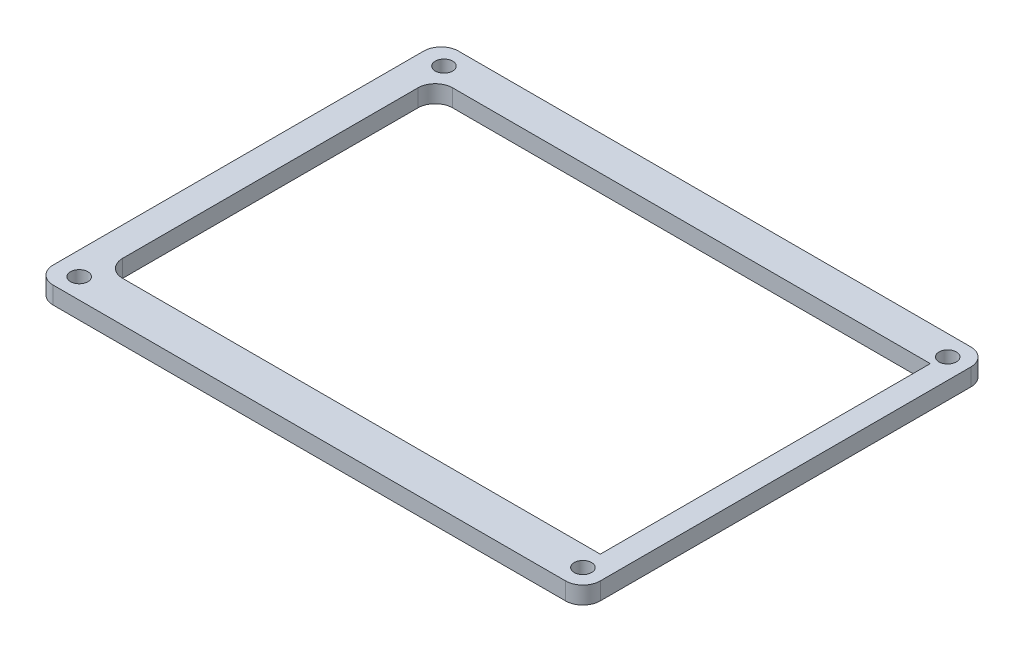
ISO-10303-21;
HEADER;
FILE_DESCRIPTION(('STEP AP214'),'2;1');
FILE_NAME('part.step','',(''),(''),'','','');
FILE_SCHEMA(('AUTOMOTIVE_DESIGN { 1 0 10303 214 1 1 1 1 }'));
ENDSEC;
DATA;
#1=APPLICATION_CONTEXT('core data for automotive mechanical design processes');
#2=APPLICATION_PROTOCOL_DEFINITION('international standard','automotive_design',2000,#1);
#3=PRODUCT_CONTEXT('',#1,'mechanical');
#4=PRODUCT('Part','Part','',(#3));
#5=PRODUCT_RELATED_PRODUCT_CATEGORY('part','',(#4));
#6=PRODUCT_DEFINITION_FORMATION('','',#4);
#7=PRODUCT_DEFINITION_CONTEXT('part definition',#1,'design');
#8=PRODUCT_DEFINITION('design','',#6,#7);
#9=PRODUCT_DEFINITION_SHAPE('','',#8);
#10=(LENGTH_UNIT() NAMED_UNIT(*) SI_UNIT(.MILLI.,.METRE.));
#11=(NAMED_UNIT(*) PLANE_ANGLE_UNIT() SI_UNIT($,.RADIAN.));
#12=(NAMED_UNIT(*) SI_UNIT($,.STERADIAN.) SOLID_ANGLE_UNIT());
#13=UNCERTAINTY_MEASURE_WITH_UNIT(LENGTH_MEASURE(1.E-05),#10,'distance_accuracy_value','');
#14=(GEOMETRIC_REPRESENTATION_CONTEXT(3) GLOBAL_UNCERTAINTY_ASSIGNED_CONTEXT((#13)) GLOBAL_UNIT_ASSIGNED_CONTEXT((#10,
#11,#12)) REPRESENTATION_CONTEXT('',''));
#15=CARTESIAN_POINT('',(0.,0.,0.));
#16=DIRECTION('',(0.,0.,1.));
#17=DIRECTION('',(1.,0.,0.));
#18=AXIS2_PLACEMENT_3D('',#15,#16,#17);
#19=CARTESIAN_POINT('',(0.,3.,0.));
#20=DIRECTION('',(0.,1.,0.));
#21=DIRECTION('',(0.,0.,1.));
#22=AXIS2_PLACEMENT_3D('',#19,#20,#21);
#23=PLANE('',#22);
#24=CARTESIAN_POINT('',(43.75,3.,31.5));
#25=DIRECTION('',(0.,1.,0.));
#26=DIRECTION('',(0.,0.,1.));
#27=AXIS2_PLACEMENT_3D('',#24,#25,#26);
#28=CIRCLE('',#27,1.5);
#29=CARTESIAN_POINT('',(43.75,3.,33.));
#30=VERTEX_POINT('',#29);
#31=EDGE_CURVE('E188',#30,#30,#28,.T.);
#32=ORIENTED_EDGE('',*,*,#31,.F.);
#33=EDGE_LOOP('',(#32));
#34=FACE_BOUND('',#33,.T.);
#35=CARTESIAN_POINT('',(-43.25,3.,31.5));
#36=DIRECTION('',(0.,1.,0.));
#37=DIRECTION('',(0.,0.,1.));
#38=AXIS2_PLACEMENT_3D('',#35,#36,#37);
#39=CIRCLE('',#38,1.5);
#40=CARTESIAN_POINT('',(-43.25,3.,33.));
#41=VERTEX_POINT('',#40);
#42=EDGE_CURVE('E203',#41,#41,#39,.T.);
#43=ORIENTED_EDGE('',*,*,#42,.F.);
#44=EDGE_LOOP('',(#43));
#45=FACE_BOUND('',#44,.T.);
#46=CARTESIAN_POINT('',(-43.25,3.,-31.5));
#47=DIRECTION('',(0.,1.,0.));
#48=DIRECTION('',(0.,0.,1.));
#49=AXIS2_PLACEMENT_3D('',#46,#47,#48);
#50=CIRCLE('',#49,1.5);
#51=CARTESIAN_POINT('',(-43.25,3.,-30.));
#52=VERTEX_POINT('',#51);
#53=EDGE_CURVE('E195',#52,#52,#50,.T.);
#54=ORIENTED_EDGE('',*,*,#53,.F.);
#55=EDGE_LOOP('',(#54));
#56=FACE_BOUND('',#55,.T.);
#57=CARTESIAN_POINT('',(43.75,3.,-31.5));
#58=DIRECTION('',(0.,1.,0.));
#59=DIRECTION('',(0.,0.,1.));
#60=AXIS2_PLACEMENT_3D('',#57,#58,#59);
#61=CIRCLE('',#60,1.5);
#62=CARTESIAN_POINT('',(43.75,3.,-30.));
#63=VERTEX_POINT('',#62);
#64=EDGE_CURVE('E194',#63,#63,#61,.T.);
#65=ORIENTED_EDGE('',*,*,#64,.F.);
#66=EDGE_LOOP('',(#65));
#67=FACE_BOUND('',#66,.T.);
#68=DIRECTION('',(0.,0.,1.));
#69=VECTOR('',#68,1.);
#70=CARTESIAN_POINT('',(-47.25,3.,-35.));
#71=LINE('',#70,#69);
#72=CARTESIAN_POINT('',(-47.25,3.,-32.));
#73=VERTEX_POINT('',#72);
#74=CARTESIAN_POINT('',(-47.25,3.,32.));
#75=VERTEX_POINT('',#74);
#76=EDGE_CURVE('E231',#73,#75,#71,.T.);
#77=ORIENTED_EDGE('',*,*,#76,.T.);
#78=CARTESIAN_POINT('',(-44.25,3.,32.));
#79=DIRECTION('',(0.,1.,0.));
#80=DIRECTION('',(0.,0.,1.));
#81=AXIS2_PLACEMENT_3D('',#78,#79,#80);
#82=CIRCLE('',#81,3.);
#83=CARTESIAN_POINT('',(-44.25,3.,35.));
#84=VERTEX_POINT('',#83);
#85=EDGE_CURVE('E288',#75,#84,#82,.T.);
#86=ORIENTED_EDGE('',*,*,#85,.T.);
#87=DIRECTION('',(1.,0.,0.));
#88=VECTOR('',#87,1.);
#89=CARTESIAN_POINT('',(-47.25,3.,35.));
#90=LINE('',#89,#88);
#91=CARTESIAN_POINT('',(44.25,3.,35.));
#92=VERTEX_POINT('',#91);
#93=EDGE_CURVE('E235',#84,#92,#90,.T.);
#94=ORIENTED_EDGE('',*,*,#93,.T.);
#95=CARTESIAN_POINT('',(44.25,3.,32.));
#96=DIRECTION('',(0.,1.,0.));
#97=DIRECTION('',(0.,0.,1.));
#98=AXIS2_PLACEMENT_3D('',#95,#96,#97);
#99=CIRCLE('',#98,3.);
#100=CARTESIAN_POINT('',(47.25,3.,32.));
#101=VERTEX_POINT('',#100);
#102=EDGE_CURVE('E279',#92,#101,#99,.T.);
#103=ORIENTED_EDGE('',*,*,#102,.T.);
#104=DIRECTION('',(0.,0.,-1.));
#105=VECTOR('',#104,1.);
#106=CARTESIAN_POINT('',(47.25,3.,-35.));
#107=LINE('',#106,#105);
#108=CARTESIAN_POINT('',(47.25,3.,-32.));
#109=VERTEX_POINT('',#108);
#110=EDGE_CURVE('E222',#101,#109,#107,.T.);
#111=ORIENTED_EDGE('',*,*,#110,.T.);
#112=CARTESIAN_POINT('',(44.25,3.,-32.));
#113=DIRECTION('',(0.,1.,0.));
#114=DIRECTION('',(0.,0.,1.));
#115=AXIS2_PLACEMENT_3D('',#112,#113,#114);
#116=CIRCLE('',#115,3.);
#117=CARTESIAN_POINT('',(44.25,3.,-35.));
#118=VERTEX_POINT('',#117);
#119=EDGE_CURVE('E282',#109,#118,#116,.T.);
#120=ORIENTED_EDGE('',*,*,#119,.T.);
#121=DIRECTION('',(-1.,0.,0.));
#122=VECTOR('',#121,1.);
#123=CARTESIAN_POINT('',(-47.25,3.,-35.));
#124=LINE('',#123,#122);
#125=CARTESIAN_POINT('',(-44.25,3.,-35.));
#126=VERTEX_POINT('',#125);
#127=EDGE_CURVE('E226',#118,#126,#124,.T.);
#128=ORIENTED_EDGE('',*,*,#127,.T.);
#129=CARTESIAN_POINT('',(-44.25,3.,-32.));
#130=DIRECTION('',(0.,1.,0.));
#131=DIRECTION('',(0.,0.,1.));
#132=AXIS2_PLACEMENT_3D('',#129,#130,#131);
#133=CIRCLE('',#132,3.);
#134=EDGE_CURVE('E285',#126,#73,#133,.T.);
#135=ORIENTED_EDGE('',*,*,#134,.T.);
#136=EDGE_LOOP('',(#77,#86,#94,#103,#111,#120,#128,#135));
#137=FACE_BOUND('',#136,.T.);
#138=DIRECTION('',(0.,0.,1.));
#139=VECTOR('',#138,1.);
#140=CARTESIAN_POINT('',(43.25,3.,0.));
#141=LINE('',#140,#139);
#142=CARTESIAN_POINT('',(43.25,3.,-29.));
#143=VERTEX_POINT('',#142);
#144=CARTESIAN_POINT('',(43.25,3.,28.));
#145=VERTEX_POINT('',#144);
#146=EDGE_CURVE('E182',#143,#145,#141,.T.);
#147=ORIENTED_EDGE('',*,*,#146,.T.);
#148=DIRECTION('',(-1.,0.,0.));
#149=VECTOR('',#148,1.);
#150=CARTESIAN_POINT('',(0.,3.,27.9999999999999));
#151=LINE('',#150,#149);
#152=CARTESIAN_POINT('',(-39.25,3.,28.));
#153=VERTEX_POINT('',#152);
#154=EDGE_CURVE('E160',#145,#153,#151,.T.);
#155=ORIENTED_EDGE('',*,*,#154,.T.);
#156=CARTESIAN_POINT('',(-39.25,3.,25.));
#157=DIRECTION('',(0.,1.,0.));
#158=DIRECTION('',(0.,0.,1.));
#159=AXIS2_PLACEMENT_3D('',#156,#157,#158);
#160=CIRCLE('',#159,3.);
#161=CARTESIAN_POINT('',(-42.25,3.,25.));
#162=VERTEX_POINT('',#161);
#163=EDGE_CURVE('E317',#153,#162,#160,.F.);
#164=ORIENTED_EDGE('',*,*,#163,.T.);
#165=DIRECTION('',(0.,0.,-1.));
#166=VECTOR('',#165,1.);
#167=CARTESIAN_POINT('',(-42.25,3.,0.));
#168=LINE('',#167,#166);
#169=CARTESIAN_POINT('',(-42.25,3.,-26.));
#170=VERTEX_POINT('',#169);
#171=EDGE_CURVE('E169',#162,#170,#168,.T.);
#172=ORIENTED_EDGE('',*,*,#171,.T.);
#173=CARTESIAN_POINT('',(-39.25,3.,-26.));
#174=DIRECTION('',(0.,1.,0.));
#175=DIRECTION('',(0.,0.,1.));
#176=AXIS2_PLACEMENT_3D('',#173,#174,#175);
#177=CIRCLE('',#176,3.);
#178=CARTESIAN_POINT('',(-39.25,3.,-29.));
#179=VERTEX_POINT('',#178);
#180=EDGE_CURVE('E48',#170,#179,#177,.F.);
#181=ORIENTED_EDGE('',*,*,#180,.T.);
#182=DIRECTION('',(1.,0.,0.));
#183=VECTOR('',#182,1.);
#184=CARTESIAN_POINT('',(0.,3.,-29.));
#185=LINE('',#184,#183);
#186=EDGE_CURVE('E172',#179,#143,#185,.T.);
#187=ORIENTED_EDGE('',*,*,#186,.T.);
#188=EDGE_LOOP('',(#147,#155,#164,#172,#181,#187));
#189=FACE_BOUND('',#188,.T.);
#190=ADVANCED_FACE('F39',(#34,#45,#56,#67,#137,#189),#23,.T.);
#191=CARTESIAN_POINT('',(0.,0.,0.));
#192=DIRECTION('',(0.,1.,0.));
#193=DIRECTION('',(0.,0.,1.));
#194=AXIS2_PLACEMENT_3D('',#191,#192,#193);
#195=PLANE('',#194);
#196=DIRECTION('',(1.,0.,0.));
#197=VECTOR('',#196,1.);
#198=CARTESIAN_POINT('',(-47.25,0.,35.));
#199=LINE('',#198,#197);
#200=CARTESIAN_POINT('',(-44.25,0.,35.));
#201=VERTEX_POINT('',#200);
#202=CARTESIAN_POINT('',(44.25,0.,35.));
#203=VERTEX_POINT('',#202);
#204=EDGE_CURVE('E227',#201,#203,#199,.T.);
#205=ORIENTED_EDGE('',*,*,#204,.F.);
#206=CARTESIAN_POINT('',(-44.25,0.,32.));
#207=DIRECTION('',(0.,1.,0.));
#208=DIRECTION('',(0.,0.,1.));
#209=AXIS2_PLACEMENT_3D('',#206,#207,#208);
#210=CIRCLE('',#209,3.);
#211=CARTESIAN_POINT('',(-47.25,0.,32.));
#212=VERTEX_POINT('',#211);
#213=EDGE_CURVE('E269',#201,#212,#210,.F.);
#214=ORIENTED_EDGE('',*,*,#213,.T.);
#215=DIRECTION('',(0.,0.,1.));
#216=VECTOR('',#215,1.);
#217=CARTESIAN_POINT('',(-47.25,0.,-35.));
#218=LINE('',#217,#216);
#219=CARTESIAN_POINT('',(-47.25,0.,-32.));
#220=VERTEX_POINT('',#219);
#221=EDGE_CURVE('E247',#220,#212,#218,.T.);
#222=ORIENTED_EDGE('',*,*,#221,.F.);
#223=CARTESIAN_POINT('',(-44.25,0.,-32.));
#224=DIRECTION('',(0.,1.,0.));
#225=DIRECTION('',(0.,0.,1.));
#226=AXIS2_PLACEMENT_3D('',#223,#224,#225);
#227=CIRCLE('',#226,3.);
#228=CARTESIAN_POINT('',(-44.25,0.,-35.));
#229=VERTEX_POINT('',#228);
#230=EDGE_CURVE('E266',#220,#229,#227,.F.);
#231=ORIENTED_EDGE('',*,*,#230,.T.);
#232=DIRECTION('',(-1.,0.,0.));
#233=VECTOR('',#232,1.);
#234=CARTESIAN_POINT('',(-47.25,0.,-35.));
#235=LINE('',#234,#233);
#236=CARTESIAN_POINT('',(44.25,0.,-35.));
#237=VERTEX_POINT('',#236);
#238=EDGE_CURVE('E243',#237,#229,#235,.T.);
#239=ORIENTED_EDGE('',*,*,#238,.F.);
#240=CARTESIAN_POINT('',(44.25,0.,-32.));
#241=DIRECTION('',(0.,1.,0.));
#242=DIRECTION('',(0.,0.,1.));
#243=AXIS2_PLACEMENT_3D('',#240,#241,#242);
#244=CIRCLE('',#243,3.);
#245=CARTESIAN_POINT('',(47.25,0.,-32.));
#246=VERTEX_POINT('',#245);
#247=EDGE_CURVE('E263',#237,#246,#244,.F.);
#248=ORIENTED_EDGE('',*,*,#247,.T.);
#249=DIRECTION('',(0.,0.,-1.));
#250=VECTOR('',#249,1.);
#251=CARTESIAN_POINT('',(47.25,0.,-35.));
#252=LINE('',#251,#250);
#253=CARTESIAN_POINT('',(47.25,0.,32.));
#254=VERTEX_POINT('',#253);
#255=EDGE_CURVE('E218',#254,#246,#252,.T.);
#256=ORIENTED_EDGE('',*,*,#255,.F.);
#257=CARTESIAN_POINT('',(44.25,0.,32.));
#258=DIRECTION('',(0.,1.,0.));
#259=DIRECTION('',(0.,0.,1.));
#260=AXIS2_PLACEMENT_3D('',#257,#258,#259);
#261=CIRCLE('',#260,3.);
#262=EDGE_CURVE('E260',#254,#203,#261,.F.);
#263=ORIENTED_EDGE('',*,*,#262,.T.);
#264=EDGE_LOOP('',(#205,#214,#222,#231,#239,#248,#256,#263));
#265=FACE_BOUND('',#264,.T.);
#266=CARTESIAN_POINT('',(43.75,0.,-31.5));
#267=DIRECTION('',(0.,1.,0.));
#268=DIRECTION('',(0.,0.,1.));
#269=AXIS2_PLACEMENT_3D('',#266,#267,#268);
#270=CIRCLE('',#269,1.5);
#271=CARTESIAN_POINT('',(43.75,0.,-30.));
#272=VERTEX_POINT('',#271);
#273=EDGE_CURVE('E214',#272,#272,#270,.T.);
#274=ORIENTED_EDGE('',*,*,#273,.T.);
#275=EDGE_LOOP('',(#274));
#276=FACE_BOUND('',#275,.T.);
#277=CARTESIAN_POINT('',(-43.25,0.,-31.5));
#278=DIRECTION('',(0.,1.,0.));
#279=DIRECTION('',(0.,0.,1.));
#280=AXIS2_PLACEMENT_3D('',#277,#278,#279);
#281=CIRCLE('',#280,1.5);
#282=CARTESIAN_POINT('',(-43.25,0.,-30.));
#283=VERTEX_POINT('',#282);
#284=EDGE_CURVE('E190',#283,#283,#281,.T.);
#285=ORIENTED_EDGE('',*,*,#284,.T.);
#286=EDGE_LOOP('',(#285));
#287=FACE_BOUND('',#286,.T.);
#288=CARTESIAN_POINT('',(-43.25,0.,31.5));
#289=DIRECTION('',(0.,1.,0.));
#290=DIRECTION('',(0.,0.,1.));
#291=AXIS2_PLACEMENT_3D('',#288,#289,#290);
#292=CIRCLE('',#291,1.5);
#293=CARTESIAN_POINT('',(-43.25,0.,33.));
#294=VERTEX_POINT('',#293);
#295=EDGE_CURVE('E199',#294,#294,#292,.T.);
#296=ORIENTED_EDGE('',*,*,#295,.T.);
#297=EDGE_LOOP('',(#296));
#298=FACE_BOUND('',#297,.T.);
#299=CARTESIAN_POINT('',(43.75,0.,31.5));
#300=DIRECTION('',(0.,1.,0.));
#301=DIRECTION('',(0.,0.,1.));
#302=AXIS2_PLACEMENT_3D('',#299,#300,#301);
#303=CIRCLE('',#302,1.5);
#304=CARTESIAN_POINT('',(43.75,0.,33.));
#305=VERTEX_POINT('',#304);
#306=EDGE_CURVE('E207',#305,#305,#303,.T.);
#307=ORIENTED_EDGE('',*,*,#306,.T.);
#308=EDGE_LOOP('',(#307));
#309=FACE_BOUND('',#308,.T.);
#310=DIRECTION('',(-1.,0.,0.));
#311=VECTOR('',#310,1.);
#312=CARTESIAN_POINT('',(0.,0.,27.9999999999999));
#313=LINE('',#312,#311);
#314=CARTESIAN_POINT('',(43.25,0.,28.));
#315=VERTEX_POINT('',#314);
#316=CARTESIAN_POINT('',(-39.25,0.,28.));
#317=VERTEX_POINT('',#316);
#318=EDGE_CURVE('E152',#315,#317,#313,.T.);
#319=ORIENTED_EDGE('',*,*,#318,.F.);
#320=DIRECTION('',(0.,0.,1.));
#321=VECTOR('',#320,1.);
#322=CARTESIAN_POINT('',(43.25,0.,0.));
#323=LINE('',#322,#321);
#324=CARTESIAN_POINT('',(43.25,0.,-29.));
#325=VERTEX_POINT('',#324);
#326=EDGE_CURVE('E140',#325,#315,#323,.T.);
#327=ORIENTED_EDGE('',*,*,#326,.F.);
#328=DIRECTION('',(1.,0.,0.));
#329=VECTOR('',#328,1.);
#330=CARTESIAN_POINT('',(0.,0.,-29.));
#331=LINE('',#330,#329);
#332=CARTESIAN_POINT('',(-39.25,0.,-29.));
#333=VERTEX_POINT('',#332);
#334=EDGE_CURVE('E151',#333,#325,#331,.T.);
#335=ORIENTED_EDGE('',*,*,#334,.F.);
#336=CARTESIAN_POINT('',(-39.25,0.,-26.));
#337=DIRECTION('',(0.,1.,0.));
#338=DIRECTION('',(0.,0.,1.));
#339=AXIS2_PLACEMENT_3D('',#336,#337,#338);
#340=CIRCLE('',#339,3.);
#341=CARTESIAN_POINT('',(-42.25,0.,-26.));
#342=VERTEX_POINT('',#341);
#343=EDGE_CURVE('E11',#333,#342,#340,.T.);
#344=ORIENTED_EDGE('',*,*,#343,.T.);
#345=DIRECTION('',(0.,0.,-1.));
#346=VECTOR('',#345,1.);
#347=CARTESIAN_POINT('',(-42.25,0.,0.));
#348=LINE('',#347,#346);
#349=CARTESIAN_POINT('',(-42.25,0.,25.));
#350=VERTEX_POINT('',#349);
#351=EDGE_CURVE('E162',#350,#342,#348,.T.);
#352=ORIENTED_EDGE('',*,*,#351,.F.);
#353=CARTESIAN_POINT('',(-39.25,0.,25.));
#354=DIRECTION('',(0.,1.,0.));
#355=DIRECTION('',(0.,0.,1.));
#356=AXIS2_PLACEMENT_3D('',#353,#354,#355);
#357=CIRCLE('',#356,3.);
#358=EDGE_CURVE('E167',#350,#317,#357,.T.);
#359=ORIENTED_EDGE('',*,*,#358,.T.);
#360=EDGE_LOOP('',(#319,#327,#335,#344,#352,#359));
#361=FACE_BOUND('',#360,.T.);
#362=ADVANCED_FACE('F164',(#265,#276,#287,#298,#309,#361),#195,.F.);
#363=CARTESIAN_POINT('',(47.25,3.,-35.));
#364=DIRECTION('',(-1.,0.,0.));
#365=DIRECTION('',(0.,0.,1.));
#366=AXIS2_PLACEMENT_3D('',#363,#364,#365);
#367=PLANE('',#366);
#368=ORIENTED_EDGE('',*,*,#255,.T.);
#369=DIRECTION('',(0.,-1.,0.));
#370=VECTOR('',#369,1.);
#371=CARTESIAN_POINT('',(47.25,3.,-32.));
#372=LINE('',#371,#370);
#373=EDGE_CURVE('E302',#246,#109,#372,.F.);
#374=ORIENTED_EDGE('',*,*,#373,.T.);
#375=ORIENTED_EDGE('',*,*,#110,.F.);
#376=DIRECTION('',(0.,-1.,0.));
#377=VECTOR('',#376,1.);
#378=CARTESIAN_POINT('',(47.25,3.,32.));
#379=LINE('',#378,#377);
#380=EDGE_CURVE('E298',#101,#254,#379,.T.);
#381=ORIENTED_EDGE('',*,*,#380,.T.);
#382=EDGE_LOOP('',(#368,#374,#375,#381));
#383=FACE_BOUND('',#382,.T.);
#384=ADVANCED_FACE('F344',(#383),#367,.F.);
#385=CARTESIAN_POINT('',(-47.25,3.,-35.));
#386=DIRECTION('',(0.,0.,1.));
#387=DIRECTION('',(1.,0.,0.));
#388=AXIS2_PLACEMENT_3D('',#385,#386,#387);
#389=PLANE('',#388);
#390=ORIENTED_EDGE('',*,*,#238,.T.);
#391=DIRECTION('',(0.,-1.,0.));
#392=VECTOR('',#391,1.);
#393=CARTESIAN_POINT('',(-44.25,3.,-35.));
#394=LINE('',#393,#392);
#395=EDGE_CURVE('E295',#229,#126,#394,.F.);
#396=ORIENTED_EDGE('',*,*,#395,.T.);
#397=ORIENTED_EDGE('',*,*,#127,.F.);
#398=DIRECTION('',(0.,-1.,0.));
#399=VECTOR('',#398,1.);
#400=CARTESIAN_POINT('',(44.25,3.,-35.));
#401=LINE('',#400,#399);
#402=EDGE_CURVE('E291',#118,#237,#401,.T.);
#403=ORIENTED_EDGE('',*,*,#402,.T.);
#404=EDGE_LOOP('',(#390,#396,#397,#403));
#405=FACE_BOUND('',#404,.T.);
#406=ADVANCED_FACE('F360',(#405),#389,.F.);
#407=CARTESIAN_POINT('',(-47.25,3.,-35.));
#408=DIRECTION('',(1.,0.,0.));
#409=DIRECTION('',(0.,0.,-1.));
#410=AXIS2_PLACEMENT_3D('',#407,#408,#409);
#411=PLANE('',#410);
#412=ORIENTED_EDGE('',*,*,#221,.T.);
#413=DIRECTION('',(0.,-1.,0.));
#414=VECTOR('',#413,1.);
#415=CARTESIAN_POINT('',(-47.25,3.,32.));
#416=LINE('',#415,#414);
#417=EDGE_CURVE('E276',#212,#75,#416,.F.);
#418=ORIENTED_EDGE('',*,*,#417,.T.);
#419=ORIENTED_EDGE('',*,*,#76,.F.);
#420=DIRECTION('',(0.,-1.,0.));
#421=VECTOR('',#420,1.);
#422=CARTESIAN_POINT('',(-47.25,3.,-32.));
#423=LINE('',#422,#421);
#424=EDGE_CURVE('E272',#73,#220,#423,.T.);
#425=ORIENTED_EDGE('',*,*,#424,.T.);
#426=EDGE_LOOP('',(#412,#418,#419,#425));
#427=FACE_BOUND('',#426,.T.);
#428=ADVANCED_FACE('F356',(#427),#411,.F.);
#429=CARTESIAN_POINT('',(-47.25,3.,35.));
#430=DIRECTION('',(0.,0.,-1.));
#431=DIRECTION('',(-1.,0.,0.));
#432=AXIS2_PLACEMENT_3D('',#429,#430,#431);
#433=PLANE('',#432);
#434=ORIENTED_EDGE('',*,*,#93,.F.);
#435=DIRECTION('',(0.,-1.,0.));
#436=VECTOR('',#435,1.);
#437=CARTESIAN_POINT('',(-44.25,3.,35.));
#438=LINE('',#437,#436);
#439=EDGE_CURVE('E256',#84,#201,#438,.T.);
#440=ORIENTED_EDGE('',*,*,#439,.T.);
#441=ORIENTED_EDGE('',*,*,#204,.T.);
#442=DIRECTION('',(0.,-1.,0.));
#443=VECTOR('',#442,1.);
#444=CARTESIAN_POINT('',(44.25,3.,35.));
#445=LINE('',#444,#443);
#446=EDGE_CURVE('E239',#203,#92,#445,.F.);
#447=ORIENTED_EDGE('',*,*,#446,.T.);
#448=EDGE_LOOP('',(#434,#440,#441,#447));
#449=FACE_BOUND('',#448,.T.);
#450=ADVANCED_FACE('F353',(#449),#433,.F.);
#451=CARTESIAN_POINT('',(43.75,0.,-31.5));
#452=DIRECTION('',(0.,1.,0.));
#453=DIRECTION('',(0.,0.,1.));
#454=AXIS2_PLACEMENT_3D('',#451,#452,#453);
#455=CYLINDRICAL_SURFACE('',#454,1.5);
#456=ORIENTED_EDGE('',*,*,#273,.F.);
#457=EDGE_LOOP('',(#456));
#458=FACE_BOUND('',#457,.T.);
#459=ORIENTED_EDGE('',*,*,#64,.T.);
#460=EDGE_LOOP('',(#459));
#461=FACE_BOUND('',#460,.T.);
#462=ADVANCED_FACE('F350',(#458,#461),#455,.F.);
#463=CARTESIAN_POINT('',(-43.25,0.,-31.5));
#464=DIRECTION('',(0.,1.,0.));
#465=DIRECTION('',(0.,0.,1.));
#466=AXIS2_PLACEMENT_3D('',#463,#464,#465);
#467=CYLINDRICAL_SURFACE('',#466,1.5);
#468=ORIENTED_EDGE('',*,*,#284,.F.);
#469=EDGE_LOOP('',(#468));
#470=FACE_BOUND('',#469,.T.);
#471=ORIENTED_EDGE('',*,*,#53,.T.);
#472=EDGE_LOOP('',(#471));
#473=FACE_BOUND('',#472,.T.);
#474=ADVANCED_FACE('F423',(#470,#473),#467,.F.);
#475=CARTESIAN_POINT('',(-43.25,0.,31.5));
#476=DIRECTION('',(0.,1.,0.));
#477=DIRECTION('',(0.,0.,1.));
#478=AXIS2_PLACEMENT_3D('',#475,#476,#477);
#479=CYLINDRICAL_SURFACE('',#478,1.5);
#480=ORIENTED_EDGE('',*,*,#295,.F.);
#481=EDGE_LOOP('',(#480));
#482=FACE_BOUND('',#481,.T.);
#483=ORIENTED_EDGE('',*,*,#42,.T.);
#484=EDGE_LOOP('',(#483));
#485=FACE_BOUND('',#484,.T.);
#486=ADVANCED_FACE('F419',(#482,#485),#479,.F.);
#487=CARTESIAN_POINT('',(43.75,0.,31.5));
#488=DIRECTION('',(0.,1.,0.));
#489=DIRECTION('',(0.,0.,1.));
#490=AXIS2_PLACEMENT_3D('',#487,#488,#489);
#491=CYLINDRICAL_SURFACE('',#490,1.5);
#492=ORIENTED_EDGE('',*,*,#306,.F.);
#493=EDGE_LOOP('',(#492));
#494=FACE_BOUND('',#493,.T.);
#495=ORIENTED_EDGE('',*,*,#31,.T.);
#496=EDGE_LOOP('',(#495));
#497=FACE_BOUND('',#496,.T.);
#498=ADVANCED_FACE('F372',(#494,#497),#491,.F.);
#499=CARTESIAN_POINT('',(-44.25,3.,32.));
#500=DIRECTION('',(0.,-1.,0.));
#501=DIRECTION('',(0.,0.,-1.));
#502=AXIS2_PLACEMENT_3D('',#499,#500,#501);
#503=CYLINDRICAL_SURFACE('',#502,3.);
#504=ORIENTED_EDGE('',*,*,#85,.F.);
#505=ORIENTED_EDGE('',*,*,#417,.F.);
#506=ORIENTED_EDGE('',*,*,#213,.F.);
#507=ORIENTED_EDGE('',*,*,#439,.F.);
#508=EDGE_LOOP('',(#504,#505,#506,#507));
#509=FACE_BOUND('',#508,.T.);
#510=ADVANCED_FACE('F368',(#509),#503,.T.);
#511=CARTESIAN_POINT('',(-44.25,3.,-32.));
#512=DIRECTION('',(0.,-1.,0.));
#513=DIRECTION('',(0.,0.,-1.));
#514=AXIS2_PLACEMENT_3D('',#511,#512,#513);
#515=CYLINDRICAL_SURFACE('',#514,3.);
#516=ORIENTED_EDGE('',*,*,#134,.F.);
#517=ORIENTED_EDGE('',*,*,#395,.F.);
#518=ORIENTED_EDGE('',*,*,#230,.F.);
#519=ORIENTED_EDGE('',*,*,#424,.F.);
#520=EDGE_LOOP('',(#516,#517,#518,#519));
#521=FACE_BOUND('',#520,.T.);
#522=ADVANCED_FACE('F371',(#521),#515,.T.);
#523=CARTESIAN_POINT('',(44.25,3.,-32.));
#524=DIRECTION('',(0.,-1.,0.));
#525=DIRECTION('',(0.,0.,-1.));
#526=AXIS2_PLACEMENT_3D('',#523,#524,#525);
#527=CYLINDRICAL_SURFACE('',#526,3.);
#528=ORIENTED_EDGE('',*,*,#119,.F.);
#529=ORIENTED_EDGE('',*,*,#373,.F.);
#530=ORIENTED_EDGE('',*,*,#247,.F.);
#531=ORIENTED_EDGE('',*,*,#402,.F.);
#532=EDGE_LOOP('',(#528,#529,#530,#531));
#533=FACE_BOUND('',#532,.T.);
#534=ADVANCED_FACE('F376',(#533),#527,.T.);
#535=CARTESIAN_POINT('',(44.25,3.,32.));
#536=DIRECTION('',(0.,-1.,0.));
#537=DIRECTION('',(0.,0.,-1.));
#538=AXIS2_PLACEMENT_3D('',#535,#536,#537);
#539=CYLINDRICAL_SURFACE('',#538,3.);
#540=ORIENTED_EDGE('',*,*,#102,.F.);
#541=ORIENTED_EDGE('',*,*,#446,.F.);
#542=ORIENTED_EDGE('',*,*,#262,.F.);
#543=ORIENTED_EDGE('',*,*,#380,.F.);
#544=EDGE_LOOP('',(#540,#541,#542,#543));
#545=FACE_BOUND('',#544,.T.);
#546=ADVANCED_FACE('F379',(#545),#539,.T.);
#547=CARTESIAN_POINT('',(0.,0.,27.9999999999999));
#548=DIRECTION('',(0.,0.,-1.));
#549=DIRECTION('',(-1.,0.,0.));
#550=AXIS2_PLACEMENT_3D('',#547,#548,#549);
#551=PLANE('',#550);
#552=ORIENTED_EDGE('',*,*,#318,.T.);
#553=DIRECTION('',(0.,1.,0.));
#554=VECTOR('',#553,1.);
#555=CARTESIAN_POINT('',(-39.25,3.,28.));
#556=LINE('',#555,#554);
#557=EDGE_CURVE('E305',#317,#153,#556,.T.);
#558=ORIENTED_EDGE('',*,*,#557,.T.);
#559=ORIENTED_EDGE('',*,*,#154,.F.);
#560=DIRECTION('',(0.,1.,0.));
#561=VECTOR('',#560,1.);
#562=CARTESIAN_POINT('',(43.25,0.,28.));
#563=LINE('',#562,#561);
#564=EDGE_CURVE('E144',#315,#145,#563,.T.);
#565=ORIENTED_EDGE('',*,*,#564,.F.);
#566=EDGE_LOOP('',(#552,#558,#559,#565));
#567=FACE_BOUND('',#566,.T.);
#568=ADVANCED_FACE('F156',(#567),#551,.T.);
#569=CARTESIAN_POINT('',(-42.25,0.,0.));
#570=DIRECTION('',(1.,0.,0.));
#571=DIRECTION('',(0.,0.,-1.));
#572=AXIS2_PLACEMENT_3D('',#569,#570,#571);
#573=PLANE('',#572);
#574=ORIENTED_EDGE('',*,*,#171,.F.);
#575=DIRECTION('',(0.,1.,0.));
#576=VECTOR('',#575,1.);
#577=CARTESIAN_POINT('',(-42.25,0.,25.));
#578=LINE('',#577,#576);
#579=EDGE_CURVE('E312',#162,#350,#578,.F.);
#580=ORIENTED_EDGE('',*,*,#579,.T.);
#581=ORIENTED_EDGE('',*,*,#351,.T.);
#582=DIRECTION('',(0.,1.,0.));
#583=VECTOR('',#582,1.);
#584=CARTESIAN_POINT('',(-42.25,3.,-26.));
#585=LINE('',#584,#583);
#586=EDGE_CURVE('E308',#342,#170,#585,.T.);
#587=ORIENTED_EDGE('',*,*,#586,.T.);
#588=EDGE_LOOP('',(#574,#580,#581,#587));
#589=FACE_BOUND('',#588,.T.);
#590=ADVANCED_FACE('F326',(#589),#573,.T.);
#591=CARTESIAN_POINT('',(0.,0.,-29.));
#592=DIRECTION('',(0.,0.,1.));
#593=DIRECTION('',(1.,0.,0.));
#594=AXIS2_PLACEMENT_3D('',#591,#592,#593);
#595=PLANE('',#594);
#596=ORIENTED_EDGE('',*,*,#186,.F.);
#597=DIRECTION('',(0.,1.,0.));
#598=VECTOR('',#597,1.);
#599=CARTESIAN_POINT('',(-39.25,0.,-29.));
#600=LINE('',#599,#598);
#601=EDGE_CURVE('E55',#179,#333,#600,.F.);
#602=ORIENTED_EDGE('',*,*,#601,.T.);
#603=ORIENTED_EDGE('',*,*,#334,.T.);
#604=DIRECTION('',(0.,1.,0.));
#605=VECTOR('',#604,1.);
#606=CARTESIAN_POINT('',(43.25,0.,-29.));
#607=LINE('',#606,#605);
#608=EDGE_CURVE('E147',#325,#143,#607,.T.);
#609=ORIENTED_EDGE('',*,*,#608,.T.);
#610=EDGE_LOOP('',(#596,#602,#603,#609));
#611=FACE_BOUND('',#610,.T.);
#612=ADVANCED_FACE('F335',(#611),#595,.T.);
#613=CARTESIAN_POINT('',(43.25,0.,0.));
#614=DIRECTION('',(-1.,0.,0.));
#615=DIRECTION('',(0.,0.,1.));
#616=AXIS2_PLACEMENT_3D('',#613,#614,#615);
#617=PLANE('',#616);
#618=ORIENTED_EDGE('',*,*,#146,.F.);
#619=ORIENTED_EDGE('',*,*,#608,.F.);
#620=ORIENTED_EDGE('',*,*,#326,.T.);
#621=ORIENTED_EDGE('',*,*,#564,.T.);
#622=EDGE_LOOP('',(#618,#619,#620,#621));
#623=FACE_BOUND('',#622,.T.);
#624=ADVANCED_FACE('F143',(#623),#617,.T.);
#625=CARTESIAN_POINT('',(-39.25,0.,25.));
#626=DIRECTION('',(0.,-1.,0.));
#627=DIRECTION('',(0.,0.,-1.));
#628=AXIS2_PLACEMENT_3D('',#625,#626,#627);
#629=CYLINDRICAL_SURFACE('',#628,3.);
#630=ORIENTED_EDGE('',*,*,#358,.F.);
#631=ORIENTED_EDGE('',*,*,#579,.F.);
#632=ORIENTED_EDGE('',*,*,#163,.F.);
#633=ORIENTED_EDGE('',*,*,#557,.F.);
#634=EDGE_LOOP('',(#630,#631,#632,#633));
#635=FACE_BOUND('',#634,.T.);
#636=ADVANCED_FACE('F328',(#635),#629,.F.);
#637=CARTESIAN_POINT('',(-39.25,0.,-26.));
#638=DIRECTION('',(0.,-1.,0.));
#639=DIRECTION('',(0.,0.,-1.));
#640=AXIS2_PLACEMENT_3D('',#637,#638,#639);
#641=CYLINDRICAL_SURFACE('',#640,3.);
#642=ORIENTED_EDGE('',*,*,#343,.F.);
#643=ORIENTED_EDGE('',*,*,#601,.F.);
#644=ORIENTED_EDGE('',*,*,#180,.F.);
#645=ORIENTED_EDGE('',*,*,#586,.F.);
#646=EDGE_LOOP('',(#642,#643,#644,#645));
#647=FACE_BOUND('',#646,.T.);
#648=ADVANCED_FACE('F41',(#647),#641,.F.);
#649=CLOSED_SHELL('',(#190,#362,#384,#406,#428,#450,#462,#474,#486,#498,#510,#522,#534,#546,
#568,#590,#612,#624,#636,#648));
#650=MANIFOLD_SOLID_BREP('B2',#649);
#651=ADVANCED_BREP_SHAPE_REPRESENTATION('',(#18,#650),#14);
#652=SHAPE_DEFINITION_REPRESENTATION(#9,#651);
ENDSEC;
END-ISO-10303-21;
